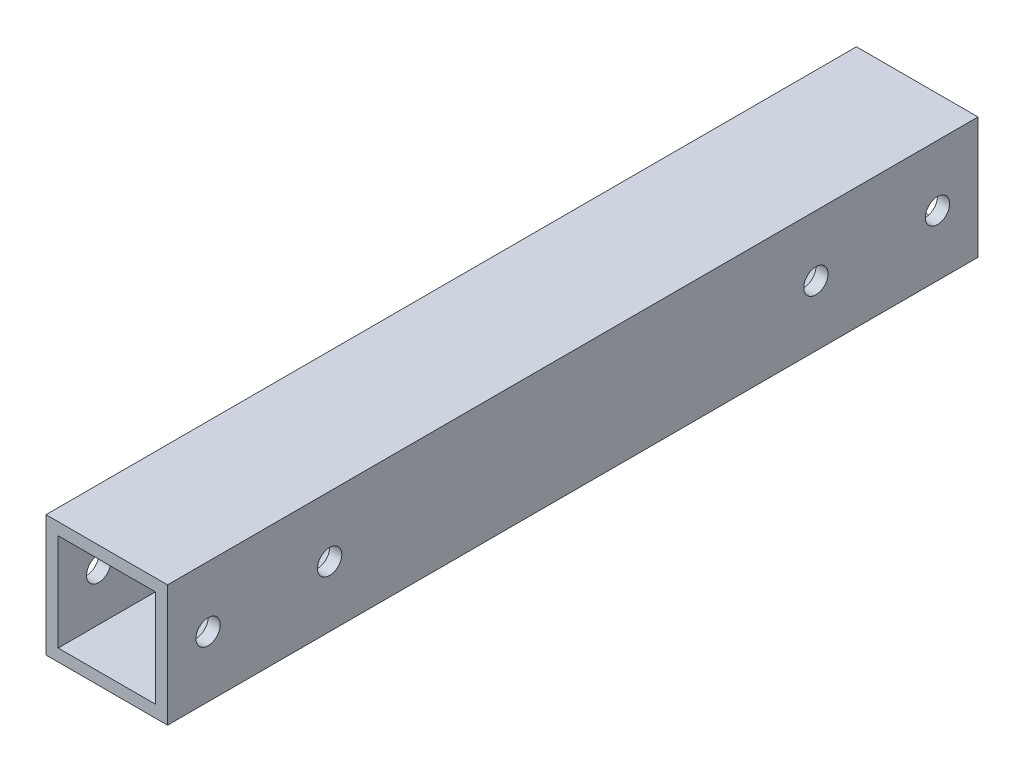
ISO-10303-21;
HEADER;
FILE_DESCRIPTION(('STEP AP214'),'2;1');
FILE_NAME('part.step','',(''),(''),'','','');
FILE_SCHEMA(('AUTOMOTIVE_DESIGN { 1 0 10303 214 1 1 1 1 }'));
ENDSEC;
DATA;
#1=APPLICATION_CONTEXT('core data for automotive mechanical design processes');
#2=APPLICATION_PROTOCOL_DEFINITION('international standard','automotive_design',2000,#1);
#3=PRODUCT_CONTEXT('',#1,'mechanical');
#4=PRODUCT('Part','Part','',(#3));
#5=PRODUCT_RELATED_PRODUCT_CATEGORY('part','',(#4));
#6=PRODUCT_DEFINITION_FORMATION('','',#4);
#7=PRODUCT_DEFINITION_CONTEXT('part definition',#1,'design');
#8=PRODUCT_DEFINITION('design','',#6,#7);
#9=PRODUCT_DEFINITION_SHAPE('','',#8);
#10=(LENGTH_UNIT() NAMED_UNIT(*) SI_UNIT(.MILLI.,.METRE.));
#11=(NAMED_UNIT(*) PLANE_ANGLE_UNIT() SI_UNIT($,.RADIAN.));
#12=(NAMED_UNIT(*) SI_UNIT($,.STERADIAN.) SOLID_ANGLE_UNIT());
#13=UNCERTAINTY_MEASURE_WITH_UNIT(LENGTH_MEASURE(1.E-05),#10,'distance_accuracy_value','');
#14=(GEOMETRIC_REPRESENTATION_CONTEXT(3) GLOBAL_UNCERTAINTY_ASSIGNED_CONTEXT((#13)) GLOBAL_UNIT_ASSIGNED_CONTEXT((#10,
#11,#12)) REPRESENTATION_CONTEXT('',''));
#15=CARTESIAN_POINT('',(0.,0.,0.));
#16=DIRECTION('',(0.,0.,1.));
#17=DIRECTION('',(1.,0.,0.));
#18=AXIS2_PLACEMENT_3D('',#15,#16,#17);
#19=CARTESIAN_POINT('',(7.5,-7.49999999999999,100.));
#20=DIRECTION('',(-1.,0.,0.));
#21=DIRECTION('',(0.,0.,1.));
#22=AXIS2_PLACEMENT_3D('',#19,#20,#21);
#23=PLANE('',#22);
#24=CARTESIAN_POINT('',(7.5,1.11070874719843E-10,79.9999999999432));
#25=DIRECTION('',(1.,0.,0.));
#26=DIRECTION('',(0.,0.,-1.));
#27=AXIS2_PLACEMENT_3D('',#24,#25,#26);
#28=CIRCLE('',#27,1.5);
#29=CARTESIAN_POINT('',(7.5,1.11070874719843E-10,78.4999999999432));
#30=VERTEX_POINT('',#29);
#31=EDGE_CURVE('E277',#30,#30,#28,.T.);
#32=ORIENTED_EDGE('',*,*,#31,.F.);
#33=EDGE_LOOP('',(#32));
#34=FACE_BOUND('',#33,.T.);
#35=CARTESIAN_POINT('',(7.5,1.11070874719843E-10,94.9999999999432));
#36=DIRECTION('',(1.,0.,0.));
#37=DIRECTION('',(0.,0.,-1.));
#38=AXIS2_PLACEMENT_3D('',#35,#36,#37);
#39=CIRCLE('',#38,1.5);
#40=CARTESIAN_POINT('',(7.5,1.11070874719843E-10,93.4999999999432));
#41=VERTEX_POINT('',#40);
#42=EDGE_CURVE('E180',#41,#41,#39,.T.);
#43=ORIENTED_EDGE('',*,*,#42,.F.);
#44=EDGE_LOOP('',(#43));
#45=FACE_BOUND('',#44,.T.);
#46=CARTESIAN_POINT('',(7.5,0.,20.));
#47=DIRECTION('',(1.,0.,0.));
#48=DIRECTION('',(0.,0.,-1.));
#49=AXIS2_PLACEMENT_3D('',#46,#47,#48);
#50=CIRCLE('',#49,1.5);
#51=CARTESIAN_POINT('',(7.5,0.,18.5));
#52=VERTEX_POINT('',#51);
#53=EDGE_CURVE('E177',#52,#52,#50,.T.);
#54=ORIENTED_EDGE('',*,*,#53,.F.);
#55=EDGE_LOOP('',(#54));
#56=FACE_BOUND('',#55,.T.);
#57=CARTESIAN_POINT('',(7.5,0.,4.9999999999999));
#58=DIRECTION('',(1.,0.,0.));
#59=DIRECTION('',(0.,0.,-1.));
#60=AXIS2_PLACEMENT_3D('',#57,#58,#59);
#61=CIRCLE('',#60,1.49999999999989);
#62=CARTESIAN_POINT('',(7.5,0.,3.50000000000001));
#63=VERTEX_POINT('',#62);
#64=EDGE_CURVE('E196',#63,#63,#61,.T.);
#65=ORIENTED_EDGE('',*,*,#64,.F.);
#66=EDGE_LOOP('',(#65));
#67=FACE_BOUND('',#66,.T.);
#68=DIRECTION('',(0.,1.,0.));
#69=VECTOR('',#68,1.);
#70=CARTESIAN_POINT('',(7.5,-7.49999999999999,0.));
#71=LINE('',#70,#69);
#72=CARTESIAN_POINT('',(7.5,-7.49999999999999,0.));
#73=VERTEX_POINT('',#72);
#74=CARTESIAN_POINT('',(7.5,7.50000000000001,0.));
#75=VERTEX_POINT('',#74);
#76=EDGE_CURVE('E133',#73,#75,#71,.T.);
#77=ORIENTED_EDGE('',*,*,#76,.T.);
#78=DIRECTION('',(0.,0.,-1.));
#79=VECTOR('',#78,1.);
#80=CARTESIAN_POINT('',(7.5,7.50000000000001,100.));
#81=LINE('',#80,#79);
#82=CARTESIAN_POINT('',(7.5,7.50000000000001,100.));
#83=VERTEX_POINT('',#82);
#84=EDGE_CURVE('E11',#83,#75,#81,.T.);
#85=ORIENTED_EDGE('',*,*,#84,.F.);
#86=DIRECTION('',(0.,1.,0.));
#87=VECTOR('',#86,1.);
#88=CARTESIAN_POINT('',(7.5,-7.49999999999999,100.));
#89=LINE('',#88,#87);
#90=CARTESIAN_POINT('',(7.5,-7.49999999999999,100.));
#91=VERTEX_POINT('',#90);
#92=EDGE_CURVE('E137',#91,#83,#89,.T.);
#93=ORIENTED_EDGE('',*,*,#92,.F.);
#94=DIRECTION('',(0.,0.,-1.));
#95=VECTOR('',#94,1.);
#96=CARTESIAN_POINT('',(7.5,-7.49999999999999,100.));
#97=LINE('',#96,#95);
#98=EDGE_CURVE('E147',#91,#73,#97,.T.);
#99=ORIENTED_EDGE('',*,*,#98,.T.);
#100=EDGE_LOOP('',(#77,#85,#93,#99));
#101=FACE_BOUND('',#100,.T.);
#102=ADVANCED_FACE('F31',(#34,#45,#56,#67,#101),#23,.F.);
#103=CARTESIAN_POINT('',(-7.5,7.50000000000001,100.));
#104=DIRECTION('',(0.,-1.,0.));
#105=DIRECTION('',(0.,0.,-1.));
#106=AXIS2_PLACEMENT_3D('',#103,#104,#105);
#107=PLANE('',#106);
#108=DIRECTION('',(-1.,0.,0.));
#109=VECTOR('',#108,1.);
#110=CARTESIAN_POINT('',(-7.5,7.50000000000001,0.));
#111=LINE('',#110,#109);
#112=CARTESIAN_POINT('',(-7.5,7.50000000000001,0.));
#113=VERTEX_POINT('',#112);
#114=EDGE_CURVE('E150',#75,#113,#111,.T.);
#115=ORIENTED_EDGE('',*,*,#114,.T.);
#116=DIRECTION('',(0.,0.,-1.));
#117=VECTOR('',#116,1.);
#118=CARTESIAN_POINT('',(-7.5,7.50000000000001,100.));
#119=LINE('',#118,#117);
#120=CARTESIAN_POINT('',(-7.5,7.50000000000001,100.));
#121=VERTEX_POINT('',#120);
#122=EDGE_CURVE('E39',#121,#113,#119,.T.);
#123=ORIENTED_EDGE('',*,*,#122,.F.);
#124=DIRECTION('',(-1.,0.,0.));
#125=VECTOR('',#124,1.);
#126=CARTESIAN_POINT('',(-7.5,7.50000000000001,100.));
#127=LINE('',#126,#125);
#128=EDGE_CURVE('E140',#83,#121,#127,.T.);
#129=ORIENTED_EDGE('',*,*,#128,.F.);
#130=ORIENTED_EDGE('',*,*,#84,.T.);
#131=EDGE_LOOP('',(#115,#123,#129,#130));
#132=FACE_BOUND('',#131,.T.);
#133=ADVANCED_FACE('F206',(#132),#107,.F.);
#134=CARTESIAN_POINT('',(-7.5,-7.49999999999999,100.));
#135=DIRECTION('',(1.,0.,0.));
#136=DIRECTION('',(0.,0.,-1.));
#137=AXIS2_PLACEMENT_3D('',#134,#135,#136);
#138=PLANE('',#137);
#139=CARTESIAN_POINT('',(-7.5,1.11070874719843E-10,79.9999999999432));
#140=DIRECTION('',(1.,0.,0.));
#141=DIRECTION('',(0.,0.,-1.));
#142=AXIS2_PLACEMENT_3D('',#139,#140,#141);
#143=CIRCLE('',#142,1.5);
#144=CARTESIAN_POINT('',(-7.5,1.11070874719843E-10,78.4999999999432));
#145=VERTEX_POINT('',#144);
#146=EDGE_CURVE('E281',#145,#145,#143,.T.);
#147=ORIENTED_EDGE('',*,*,#146,.T.);
#148=EDGE_LOOP('',(#147));
#149=FACE_BOUND('',#148,.T.);
#150=CARTESIAN_POINT('',(-7.5,1.11070874719843E-10,94.9999999999432));
#151=DIRECTION('',(1.,0.,0.));
#152=DIRECTION('',(0.,0.,-1.));
#153=AXIS2_PLACEMENT_3D('',#150,#151,#152);
#154=CIRCLE('',#153,1.5);
#155=CARTESIAN_POINT('',(-7.5,1.11070874719843E-10,93.4999999999432));
#156=VERTEX_POINT('',#155);
#157=EDGE_CURVE('E173',#156,#156,#154,.T.);
#158=ORIENTED_EDGE('',*,*,#157,.T.);
#159=EDGE_LOOP('',(#158));
#160=FACE_BOUND('',#159,.T.);
#161=CARTESIAN_POINT('',(-7.5,0.,20.));
#162=DIRECTION('',(1.,0.,0.));
#163=DIRECTION('',(0.,0.,-1.));
#164=AXIS2_PLACEMENT_3D('',#161,#162,#163);
#165=CIRCLE('',#164,1.5);
#166=CARTESIAN_POINT('',(-7.5,0.,18.5));
#167=VERTEX_POINT('',#166);
#168=EDGE_CURVE('E169',#167,#167,#165,.T.);
#169=ORIENTED_EDGE('',*,*,#168,.T.);
#170=EDGE_LOOP('',(#169));
#171=FACE_BOUND('',#170,.T.);
#172=CARTESIAN_POINT('',(-7.5,0.,4.9999999999999));
#173=DIRECTION('',(1.,0.,0.));
#174=DIRECTION('',(0.,0.,-1.));
#175=AXIS2_PLACEMENT_3D('',#172,#173,#174);
#176=CIRCLE('',#175,1.49999999999989);
#177=CARTESIAN_POINT('',(-7.5,0.,3.50000000000001));
#178=VERTEX_POINT('',#177);
#179=EDGE_CURVE('E165',#178,#178,#176,.T.);
#180=ORIENTED_EDGE('',*,*,#179,.T.);
#181=EDGE_LOOP('',(#180));
#182=FACE_BOUND('',#181,.T.);
#183=DIRECTION('',(0.,-1.,0.));
#184=VECTOR('',#183,1.);
#185=CARTESIAN_POINT('',(-7.5,-7.49999999999999,0.));
#186=LINE('',#185,#184);
#187=CARTESIAN_POINT('',(-7.5,-7.49999999999999,0.));
#188=VERTEX_POINT('',#187);
#189=EDGE_CURVE('E152',#113,#188,#186,.T.);
#190=ORIENTED_EDGE('',*,*,#189,.T.);
#191=DIRECTION('',(0.,0.,-1.));
#192=VECTOR('',#191,1.);
#193=CARTESIAN_POINT('',(-7.5,-7.49999999999999,100.));
#194=LINE('',#193,#192);
#195=CARTESIAN_POINT('',(-7.5,-7.49999999999999,100.));
#196=VERTEX_POINT('',#195);
#197=EDGE_CURVE('E157',#196,#188,#194,.T.);
#198=ORIENTED_EDGE('',*,*,#197,.F.);
#199=DIRECTION('',(0.,-1.,0.));
#200=VECTOR('',#199,1.);
#201=CARTESIAN_POINT('',(-7.5,-7.49999999999999,100.));
#202=LINE('',#201,#200);
#203=EDGE_CURVE('E143',#121,#196,#202,.T.);
#204=ORIENTED_EDGE('',*,*,#203,.F.);
#205=ORIENTED_EDGE('',*,*,#122,.T.);
#206=EDGE_LOOP('',(#190,#198,#204,#205));
#207=FACE_BOUND('',#206,.T.);
#208=ADVANCED_FACE('F224',(#149,#160,#171,#182,#207),#138,.F.);
#209=CARTESIAN_POINT('',(-7.5,-7.49999999999999,100.));
#210=DIRECTION('',(0.,1.,0.));
#211=DIRECTION('',(0.,0.,1.));
#212=AXIS2_PLACEMENT_3D('',#209,#210,#211);
#213=PLANE('',#212);
#214=DIRECTION('',(1.,0.,0.));
#215=VECTOR('',#214,1.);
#216=CARTESIAN_POINT('',(-7.5,-7.49999999999999,0.));
#217=LINE('',#216,#215);
#218=EDGE_CURVE('E141',#188,#73,#217,.T.);
#219=ORIENTED_EDGE('',*,*,#218,.T.);
#220=ORIENTED_EDGE('',*,*,#98,.F.);
#221=DIRECTION('',(1.,0.,0.));
#222=VECTOR('',#221,1.);
#223=CARTESIAN_POINT('',(-7.5,-7.49999999999999,100.));
#224=LINE('',#223,#222);
#225=EDGE_CURVE('E145',#196,#91,#224,.T.);
#226=ORIENTED_EDGE('',*,*,#225,.F.);
#227=ORIENTED_EDGE('',*,*,#197,.T.);
#228=EDGE_LOOP('',(#219,#220,#226,#227));
#229=FACE_BOUND('',#228,.T.);
#230=ADVANCED_FACE('F222',(#229),#213,.F.);
#231=CARTESIAN_POINT('',(7.5,7.50000000000001,100.));
#232=DIRECTION('',(0.,0.,-1.));
#233=DIRECTION('',(-1.,0.,0.));
#234=AXIS2_PLACEMENT_3D('',#231,#232,#233);
#235=PLANE('',#234);
#236=DIRECTION('',(-1.,0.,0.));
#237=VECTOR('',#236,1.);
#238=CARTESIAN_POINT('',(-6.,6.00000000000001,100.));
#239=LINE('',#238,#237);
#240=CARTESIAN_POINT('',(6.,6.00000000000001,100.));
#241=VERTEX_POINT('',#240);
#242=CARTESIAN_POINT('',(-6.,6.00000000000001,100.));
#243=VERTEX_POINT('',#242);
#244=EDGE_CURVE('E127',#241,#243,#239,.T.);
#245=ORIENTED_EDGE('',*,*,#244,.F.);
#246=DIRECTION('',(0.,1.,0.));
#247=VECTOR('',#246,1.);
#248=CARTESIAN_POINT('',(6.,-6.00000000000001,100.));
#249=LINE('',#248,#247);
#250=CARTESIAN_POINT('',(6.,-6.00000000000001,100.));
#251=VERTEX_POINT('',#250);
#252=EDGE_CURVE('E47',#251,#241,#249,.T.);
#253=ORIENTED_EDGE('',*,*,#252,.F.);
#254=DIRECTION('',(1.,0.,0.));
#255=VECTOR('',#254,1.);
#256=CARTESIAN_POINT('',(-6.,-6.00000000000001,100.));
#257=LINE('',#256,#255);
#258=CARTESIAN_POINT('',(-6.,-6.00000000000001,100.));
#259=VERTEX_POINT('',#258);
#260=EDGE_CURVE('E115',#259,#251,#257,.T.);
#261=ORIENTED_EDGE('',*,*,#260,.F.);
#262=DIRECTION('',(0.,-1.,0.));
#263=VECTOR('',#262,1.);
#264=CARTESIAN_POINT('',(-6.,-6.00000000000001,100.));
#265=LINE('',#264,#263);
#266=EDGE_CURVE('E118',#243,#259,#265,.T.);
#267=ORIENTED_EDGE('',*,*,#266,.F.);
#268=EDGE_LOOP('',(#245,#253,#261,#267));
#269=FACE_BOUND('',#268,.T.);
#270=ORIENTED_EDGE('',*,*,#92,.T.);
#271=ORIENTED_EDGE('',*,*,#128,.T.);
#272=ORIENTED_EDGE('',*,*,#203,.T.);
#273=ORIENTED_EDGE('',*,*,#225,.T.);
#274=EDGE_LOOP('',(#270,#271,#272,#273));
#275=FACE_BOUND('',#274,.T.);
#276=ADVANCED_FACE('F218',(#269,#275),#235,.F.);
#277=CARTESIAN_POINT('',(7.5,7.50000000000001,0.));
#278=DIRECTION('',(0.,0.,-1.));
#279=DIRECTION('',(-1.,0.,0.));
#280=AXIS2_PLACEMENT_3D('',#277,#278,#279);
#281=PLANE('',#280);
#282=DIRECTION('',(0.,1.,0.));
#283=VECTOR('',#282,1.);
#284=CARTESIAN_POINT('',(6.,-6.00000000000001,0.));
#285=LINE('',#284,#283);
#286=CARTESIAN_POINT('',(6.,-6.00000000000001,0.));
#287=VERTEX_POINT('',#286);
#288=CARTESIAN_POINT('',(6.,6.00000000000001,0.));
#289=VERTEX_POINT('',#288);
#290=EDGE_CURVE('E99',#287,#289,#285,.T.);
#291=ORIENTED_EDGE('',*,*,#290,.T.);
#292=DIRECTION('',(-1.,0.,0.));
#293=VECTOR('',#292,1.);
#294=CARTESIAN_POINT('',(-6.,6.00000000000001,0.));
#295=LINE('',#294,#293);
#296=CARTESIAN_POINT('',(-6.,6.00000000000001,0.));
#297=VERTEX_POINT('',#296);
#298=EDGE_CURVE('E108',#289,#297,#295,.T.);
#299=ORIENTED_EDGE('',*,*,#298,.T.);
#300=DIRECTION('',(0.,-1.,0.));
#301=VECTOR('',#300,1.);
#302=CARTESIAN_POINT('',(-6.,-6.00000000000001,0.));
#303=LINE('',#302,#301);
#304=CARTESIAN_POINT('',(-6.,-6.00000000000001,0.));
#305=VERTEX_POINT('',#304);
#306=EDGE_CURVE('E55',#297,#305,#303,.T.);
#307=ORIENTED_EDGE('',*,*,#306,.T.);
#308=DIRECTION('',(1.,0.,0.));
#309=VECTOR('',#308,1.);
#310=CARTESIAN_POINT('',(-6.,-6.00000000000001,0.));
#311=LINE('',#310,#309);
#312=EDGE_CURVE('E105',#305,#287,#311,.T.);
#313=ORIENTED_EDGE('',*,*,#312,.T.);
#314=EDGE_LOOP('',(#291,#299,#307,#313));
#315=FACE_BOUND('',#314,.T.);
#316=ORIENTED_EDGE('',*,*,#76,.F.);
#317=ORIENTED_EDGE('',*,*,#218,.F.);
#318=ORIENTED_EDGE('',*,*,#189,.F.);
#319=ORIENTED_EDGE('',*,*,#114,.F.);
#320=EDGE_LOOP('',(#316,#317,#318,#319));
#321=FACE_BOUND('',#320,.T.);
#322=ADVANCED_FACE('F112',(#315,#321),#281,.T.);
#323=CARTESIAN_POINT('',(6.,-6.00000000000001,0.));
#324=DIRECTION('',(1.,0.,0.));
#325=DIRECTION('',(0.,0.,-1.));
#326=AXIS2_PLACEMENT_3D('',#323,#324,#325);
#327=PLANE('',#326);
#328=CARTESIAN_POINT('',(6.,1.11070874719843E-10,79.9999999999432));
#329=DIRECTION('',(1.,0.,0.));
#330=DIRECTION('',(0.,0.,-1.));
#331=AXIS2_PLACEMENT_3D('',#328,#329,#330);
#332=CIRCLE('',#331,1.5);
#333=CARTESIAN_POINT('',(6.,1.11070874719843E-10,78.4999999999432));
#334=VERTEX_POINT('',#333);
#335=EDGE_CURVE('E185',#334,#334,#332,.T.);
#336=ORIENTED_EDGE('',*,*,#335,.T.);
#337=EDGE_LOOP('',(#336));
#338=FACE_BOUND('',#337,.T.);
#339=CARTESIAN_POINT('',(6.,1.11070874719843E-10,94.9999999999432));
#340=DIRECTION('',(1.,0.,0.));
#341=DIRECTION('',(0.,0.,-1.));
#342=AXIS2_PLACEMENT_3D('',#339,#340,#341);
#343=CIRCLE('',#342,1.5);
#344=CARTESIAN_POINT('',(6.,1.11070874719843E-10,93.4999999999432));
#345=VERTEX_POINT('',#344);
#346=EDGE_CURVE('E172',#345,#345,#343,.T.);
#347=ORIENTED_EDGE('',*,*,#346,.T.);
#348=EDGE_LOOP('',(#347));
#349=FACE_BOUND('',#348,.T.);
#350=CARTESIAN_POINT('',(6.,0.,20.));
#351=DIRECTION('',(1.,0.,0.));
#352=DIRECTION('',(0.,0.,-1.));
#353=AXIS2_PLACEMENT_3D('',#350,#351,#352);
#354=CIRCLE('',#353,1.5);
#355=CARTESIAN_POINT('',(6.,0.,18.5));
#356=VERTEX_POINT('',#355);
#357=EDGE_CURVE('E168',#356,#356,#354,.T.);
#358=ORIENTED_EDGE('',*,*,#357,.T.);
#359=EDGE_LOOP('',(#358));
#360=FACE_BOUND('',#359,.T.);
#361=CARTESIAN_POINT('',(6.,0.,4.9999999999999));
#362=DIRECTION('',(1.,0.,0.));
#363=DIRECTION('',(0.,0.,-1.));
#364=AXIS2_PLACEMENT_3D('',#361,#362,#363);
#365=CIRCLE('',#364,1.49999999999989);
#366=CARTESIAN_POINT('',(6.,0.,3.50000000000001));
#367=VERTEX_POINT('',#366);
#368=EDGE_CURVE('E121',#367,#367,#365,.T.);
#369=ORIENTED_EDGE('',*,*,#368,.T.);
#370=EDGE_LOOP('',(#369));
#371=FACE_BOUND('',#370,.T.);
#372=ORIENTED_EDGE('',*,*,#252,.T.);
#373=DIRECTION('',(0.,0.,1.));
#374=VECTOR('',#373,1.);
#375=CARTESIAN_POINT('',(6.,6.00000000000001,0.));
#376=LINE('',#375,#374);
#377=EDGE_CURVE('E95',#289,#241,#376,.T.);
#378=ORIENTED_EDGE('',*,*,#377,.F.);
#379=ORIENTED_EDGE('',*,*,#290,.F.);
#380=DIRECTION('',(0.,0.,1.));
#381=VECTOR('',#380,1.);
#382=CARTESIAN_POINT('',(6.,-6.00000000000001,0.));
#383=LINE('',#382,#381);
#384=EDGE_CURVE('E131',#287,#251,#383,.T.);
#385=ORIENTED_EDGE('',*,*,#384,.T.);
#386=EDGE_LOOP('',(#372,#378,#379,#385));
#387=FACE_BOUND('',#386,.T.);
#388=ADVANCED_FACE('F97',(#338,#349,#360,#371,#387),#327,.F.);
#389=CARTESIAN_POINT('',(-6.,-6.00000000000001,0.));
#390=DIRECTION('',(0.,-1.,0.));
#391=DIRECTION('',(0.,0.,-1.));
#392=AXIS2_PLACEMENT_3D('',#389,#390,#391);
#393=PLANE('',#392);
#394=ORIENTED_EDGE('',*,*,#260,.T.);
#395=ORIENTED_EDGE('',*,*,#384,.F.);
#396=ORIENTED_EDGE('',*,*,#312,.F.);
#397=DIRECTION('',(0.,0.,1.));
#398=VECTOR('',#397,1.);
#399=CARTESIAN_POINT('',(-6.,-6.00000000000001,0.));
#400=LINE('',#399,#398);
#401=EDGE_CURVE('E134',#305,#259,#400,.T.);
#402=ORIENTED_EDGE('',*,*,#401,.T.);
#403=EDGE_LOOP('',(#394,#395,#396,#402));
#404=FACE_BOUND('',#403,.T.);
#405=ADVANCED_FACE('F242',(#404),#393,.F.);
#406=CARTESIAN_POINT('',(-6.,-6.00000000000001,0.));
#407=DIRECTION('',(-1.,0.,0.));
#408=DIRECTION('',(0.,0.,1.));
#409=AXIS2_PLACEMENT_3D('',#406,#407,#408);
#410=PLANE('',#409);
#411=CARTESIAN_POINT('',(-6.,1.11070874719843E-10,79.9999999999432));
#412=DIRECTION('',(-1.,0.,0.));
#413=DIRECTION('',(0.,0.,1.));
#414=AXIS2_PLACEMENT_3D('',#411,#412,#413);
#415=CIRCLE('',#414,1.5);
#416=CARTESIAN_POINT('',(-6.,1.11070874719843E-10,81.4999999999432));
#417=VERTEX_POINT('',#416);
#418=EDGE_CURVE('E34',#417,#417,#415,.T.);
#419=ORIENTED_EDGE('',*,*,#418,.T.);
#420=EDGE_LOOP('',(#419));
#421=FACE_BOUND('',#420,.T.);
#422=CARTESIAN_POINT('',(-6.,1.11070874719843E-10,94.9999999999432));
#423=DIRECTION('',(-1.,0.,0.));
#424=DIRECTION('',(0.,0.,1.));
#425=AXIS2_PLACEMENT_3D('',#422,#423,#424);
#426=CIRCLE('',#425,1.5);
#427=CARTESIAN_POINT('',(-6.,1.11070874719843E-10,96.4999999999432));
#428=VERTEX_POINT('',#427);
#429=EDGE_CURVE('E170',#428,#428,#426,.T.);
#430=ORIENTED_EDGE('',*,*,#429,.T.);
#431=EDGE_LOOP('',(#430));
#432=FACE_BOUND('',#431,.T.);
#433=CARTESIAN_POINT('',(-6.,0.,20.));
#434=DIRECTION('',(-1.,0.,0.));
#435=DIRECTION('',(0.,0.,1.));
#436=AXIS2_PLACEMENT_3D('',#433,#434,#435);
#437=CIRCLE('',#436,1.5);
#438=CARTESIAN_POINT('',(-6.,0.,21.5));
#439=VERTEX_POINT('',#438);
#440=EDGE_CURVE('E166',#439,#439,#437,.T.);
#441=ORIENTED_EDGE('',*,*,#440,.T.);
#442=EDGE_LOOP('',(#441));
#443=FACE_BOUND('',#442,.T.);
#444=CARTESIAN_POINT('',(-6.,0.,4.9999999999999));
#445=DIRECTION('',(-1.,0.,0.));
#446=DIRECTION('',(0.,0.,1.));
#447=AXIS2_PLACEMENT_3D('',#444,#445,#446);
#448=CIRCLE('',#447,1.49999999999989);
#449=CARTESIAN_POINT('',(-6.,0.,6.49999999999979));
#450=VERTEX_POINT('',#449);
#451=EDGE_CURVE('E162',#450,#450,#448,.T.);
#452=ORIENTED_EDGE('',*,*,#451,.T.);
#453=EDGE_LOOP('',(#452));
#454=FACE_BOUND('',#453,.T.);
#455=ORIENTED_EDGE('',*,*,#266,.T.);
#456=ORIENTED_EDGE('',*,*,#401,.F.);
#457=ORIENTED_EDGE('',*,*,#306,.F.);
#458=DIRECTION('',(0.,0.,1.));
#459=VECTOR('',#458,1.);
#460=CARTESIAN_POINT('',(-6.,6.00000000000001,0.));
#461=LINE('',#460,#459);
#462=EDGE_CURVE('E104',#297,#243,#461,.T.);
#463=ORIENTED_EDGE('',*,*,#462,.T.);
#464=EDGE_LOOP('',(#455,#456,#457,#463));
#465=FACE_BOUND('',#464,.T.);
#466=ADVANCED_FACE('F247',(#421,#432,#443,#454,#465),#410,.F.);
#467=CARTESIAN_POINT('',(-6.,6.00000000000001,0.));
#468=DIRECTION('',(0.,1.,0.));
#469=DIRECTION('',(0.,0.,1.));
#470=AXIS2_PLACEMENT_3D('',#467,#468,#469);
#471=PLANE('',#470);
#472=ORIENTED_EDGE('',*,*,#244,.T.);
#473=ORIENTED_EDGE('',*,*,#462,.F.);
#474=ORIENTED_EDGE('',*,*,#298,.F.);
#475=ORIENTED_EDGE('',*,*,#377,.T.);
#476=EDGE_LOOP('',(#472,#473,#474,#475));
#477=FACE_BOUND('',#476,.T.);
#478=ADVANCED_FACE('F109',(#477),#471,.F.);
#479=CARTESIAN_POINT('',(-7.5,0.,4.9999999999999));
#480=DIRECTION('',(1.,0.,0.));
#481=DIRECTION('',(0.,0.,-1.));
#482=AXIS2_PLACEMENT_3D('',#479,#480,#481);
#483=CYLINDRICAL_SURFACE('',#482,1.49999999999989);
#484=ORIENTED_EDGE('',*,*,#179,.F.);
#485=EDGE_LOOP('',(#484));
#486=FACE_BOUND('',#485,.T.);
#487=ORIENTED_EDGE('',*,*,#451,.F.);
#488=EDGE_LOOP('',(#487));
#489=FACE_BOUND('',#488,.T.);
#490=ADVANCED_FACE('F246',(#486,#489),#483,.F.);
#491=ORIENTED_EDGE('',*,*,#64,.T.);
#492=EDGE_LOOP('',(#491));
#493=FACE_BOUND('',#492,.T.);
#494=ORIENTED_EDGE('',*,*,#368,.F.);
#495=EDGE_LOOP('',(#494));
#496=FACE_BOUND('',#495,.T.);
#497=ADVANCED_FACE('F201',(#493,#496),#483,.F.);
#498=CARTESIAN_POINT('',(-7.5,0.,20.));
#499=DIRECTION('',(1.,0.,0.));
#500=DIRECTION('',(0.,0.,-1.));
#501=AXIS2_PLACEMENT_3D('',#498,#499,#500);
#502=CYLINDRICAL_SURFACE('',#501,1.5);
#503=ORIENTED_EDGE('',*,*,#168,.F.);
#504=EDGE_LOOP('',(#503));
#505=FACE_BOUND('',#504,.T.);
#506=ORIENTED_EDGE('',*,*,#440,.F.);
#507=EDGE_LOOP('',(#506));
#508=FACE_BOUND('',#507,.T.);
#509=ADVANCED_FACE('F256',(#505,#508),#502,.F.);
#510=ORIENTED_EDGE('',*,*,#53,.T.);
#511=EDGE_LOOP('',(#510));
#512=FACE_BOUND('',#511,.T.);
#513=ORIENTED_EDGE('',*,*,#357,.F.);
#514=EDGE_LOOP('',(#513));
#515=FACE_BOUND('',#514,.T.);
#516=ADVANCED_FACE('F257',(#512,#515),#502,.F.);
#517=CARTESIAN_POINT('',(-7.5,1.11070874719843E-10,94.9999999999432));
#518=DIRECTION('',(1.,0.,0.));
#519=DIRECTION('',(0.,0.,-1.));
#520=AXIS2_PLACEMENT_3D('',#517,#518,#519);
#521=CYLINDRICAL_SURFACE('',#520,1.5);
#522=ORIENTED_EDGE('',*,*,#157,.F.);
#523=EDGE_LOOP('',(#522));
#524=FACE_BOUND('',#523,.T.);
#525=ORIENTED_EDGE('',*,*,#429,.F.);
#526=EDGE_LOOP('',(#525));
#527=FACE_BOUND('',#526,.T.);
#528=ADVANCED_FACE('F260',(#524,#527),#521,.F.);
#529=ORIENTED_EDGE('',*,*,#42,.T.);
#530=EDGE_LOOP('',(#529));
#531=FACE_BOUND('',#530,.T.);
#532=ORIENTED_EDGE('',*,*,#346,.F.);
#533=EDGE_LOOP('',(#532));
#534=FACE_BOUND('',#533,.T.);
#535=ADVANCED_FACE('F262',(#531,#534),#521,.F.);
#536=CARTESIAN_POINT('',(-7.5,1.11070874719843E-10,79.9999999999432));
#537=DIRECTION('',(1.,0.,0.));
#538=DIRECTION('',(0.,0.,-1.));
#539=AXIS2_PLACEMENT_3D('',#536,#537,#538);
#540=CYLINDRICAL_SURFACE('',#539,1.5);
#541=ORIENTED_EDGE('',*,*,#146,.F.);
#542=EDGE_LOOP('',(#541));
#543=FACE_BOUND('',#542,.T.);
#544=ORIENTED_EDGE('',*,*,#418,.F.);
#545=EDGE_LOOP('',(#544));
#546=FACE_BOUND('',#545,.T.);
#547=ADVANCED_FACE('F265',(#543,#546),#540,.F.);
#548=ORIENTED_EDGE('',*,*,#31,.T.);
#549=EDGE_LOOP('',(#548));
#550=FACE_BOUND('',#549,.T.);
#551=ORIENTED_EDGE('',*,*,#335,.F.);
#552=EDGE_LOOP('',(#551));
#553=FACE_BOUND('',#552,.T.);
#554=ADVANCED_FACE('F267',(#550,#553),#540,.F.);
#555=CLOSED_SHELL('',(#102,#133,#208,#230,#276,#322,#388,#405,#466,#478,#490,#497,#509,#516,
#528,#535,#547,#554));
#556=MANIFOLD_SOLID_BREP('B2',#555);
#557=ADVANCED_BREP_SHAPE_REPRESENTATION('',(#18,#556),#14);
#558=SHAPE_DEFINITION_REPRESENTATION(#9,#557);
ENDSEC;
END-ISO-10303-21;
